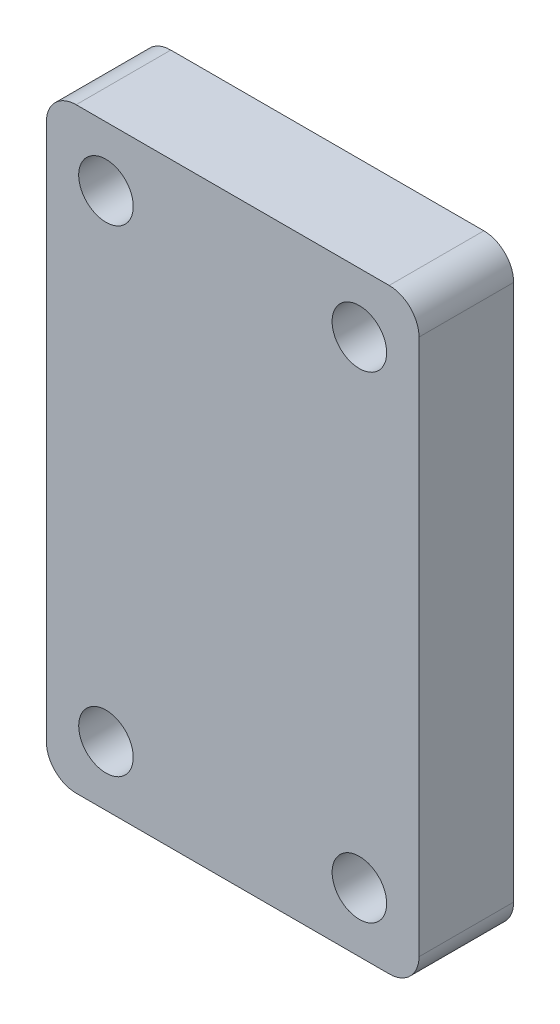
ISO-10303-21;
HEADER;
FILE_DESCRIPTION(('STEP AP214'),'2;1');
FILE_NAME('part.step','',(''),(''),'','','');
FILE_SCHEMA(('AUTOMOTIVE_DESIGN { 1 0 10303 214 1 1 1 1 }'));
ENDSEC;
DATA;
#1=APPLICATION_CONTEXT('core data for automotive mechanical design processes');
#2=APPLICATION_PROTOCOL_DEFINITION('international standard','automotive_design',2000,#1);
#3=PRODUCT_CONTEXT('',#1,'mechanical');
#4=PRODUCT('Part','Part','',(#3));
#5=PRODUCT_RELATED_PRODUCT_CATEGORY('part','',(#4));
#6=PRODUCT_DEFINITION_FORMATION('','',#4);
#7=PRODUCT_DEFINITION_CONTEXT('part definition',#1,'design');
#8=PRODUCT_DEFINITION('design','',#6,#7);
#9=PRODUCT_DEFINITION_SHAPE('','',#8);
#10=(LENGTH_UNIT() NAMED_UNIT(*) SI_UNIT(.MILLI.,.METRE.));
#11=(NAMED_UNIT(*) PLANE_ANGLE_UNIT() SI_UNIT($,.RADIAN.));
#12=(NAMED_UNIT(*) SI_UNIT($,.STERADIAN.) SOLID_ANGLE_UNIT());
#13=UNCERTAINTY_MEASURE_WITH_UNIT(LENGTH_MEASURE(1.E-05),#10,'distance_accuracy_value','');
#14=(GEOMETRIC_REPRESENTATION_CONTEXT(3) GLOBAL_UNCERTAINTY_ASSIGNED_CONTEXT((#13)) GLOBAL_UNIT_ASSIGNED_CONTEXT((#10,
#11,#12)) REPRESENTATION_CONTEXT('',''));
#15=CARTESIAN_POINT('',(0.,0.,0.));
#16=DIRECTION('',(0.,0.,1.));
#17=DIRECTION('',(1.,0.,0.));
#18=AXIS2_PLACEMENT_3D('',#15,#16,#17);
#19=CARTESIAN_POINT('',(-12.5,20.,3.175));
#20=DIRECTION('',(1.,0.,0.));
#21=DIRECTION('',(0.,0.,-1.));
#22=AXIS2_PLACEMENT_3D('',#19,#20,#21);
#23=PLANE('',#22);
#24=DIRECTION('',(0.,-1.,0.));
#25=VECTOR('',#24,1.);
#26=CARTESIAN_POINT('',(-12.5,20.,-3.175));
#27=LINE('',#26,#25);
#28=CARTESIAN_POINT('',(-12.5,18.,-3.175));
#29=VERTEX_POINT('',#28);
#30=CARTESIAN_POINT('',(-12.5,-18.,-3.175));
#31=VERTEX_POINT('',#30);
#32=EDGE_CURVE('E135',#29,#31,#27,.T.);
#33=ORIENTED_EDGE('',*,*,#32,.T.);
#34=DIRECTION('',(0.,0.,-1.));
#35=VECTOR('',#34,1.);
#36=CARTESIAN_POINT('',(-12.5,-18.,3.175));
#37=LINE('',#36,#35);
#38=CARTESIAN_POINT('',(-12.5,-18.,3.175));
#39=VERTEX_POINT('',#38);
#40=EDGE_CURVE('E110',#31,#39,#37,.F.);
#41=ORIENTED_EDGE('',*,*,#40,.T.);
#42=DIRECTION('',(0.,-1.,0.));
#43=VECTOR('',#42,1.);
#44=CARTESIAN_POINT('',(-12.5,20.,3.175));
#45=LINE('',#44,#43);
#46=CARTESIAN_POINT('',(-12.5,18.,3.175));
#47=VERTEX_POINT('',#46);
#48=EDGE_CURVE('E148',#47,#39,#45,.T.);
#49=ORIENTED_EDGE('',*,*,#48,.F.);
#50=DIRECTION('',(0.,0.,-1.));
#51=VECTOR('',#50,1.);
#52=CARTESIAN_POINT('',(-12.5,18.,3.175));
#53=LINE('',#52,#51);
#54=EDGE_CURVE('E116',#47,#29,#53,.T.);
#55=ORIENTED_EDGE('',*,*,#54,.T.);
#56=EDGE_LOOP('',(#33,#41,#49,#55));
#57=FACE_BOUND('',#56,.T.);
#58=ADVANCED_FACE('F39',(#57),#23,.F.);
#59=CARTESIAN_POINT('',(-12.5,-20.,3.175));
#60=DIRECTION('',(0.,1.,0.));
#61=DIRECTION('',(0.,0.,1.));
#62=AXIS2_PLACEMENT_3D('',#59,#60,#61);
#63=PLANE('',#62);
#64=DIRECTION('',(1.,0.,0.));
#65=VECTOR('',#64,1.);
#66=CARTESIAN_POINT('',(-12.5,-20.,3.175));
#67=LINE('',#66,#65);
#68=CARTESIAN_POINT('',(-10.5,-20.,3.175));
#69=VERTEX_POINT('',#68);
#70=CARTESIAN_POINT('',(10.5,-20.,3.175));
#71=VERTEX_POINT('',#70);
#72=EDGE_CURVE('E126',#69,#71,#67,.T.);
#73=ORIENTED_EDGE('',*,*,#72,.F.);
#74=DIRECTION('',(0.,0.,-1.));
#75=VECTOR('',#74,1.);
#76=CARTESIAN_POINT('',(-10.5,-20.,3.175));
#77=LINE('',#76,#75);
#78=CARTESIAN_POINT('',(-10.5,-20.,-3.175));
#79=VERTEX_POINT('',#78);
#80=EDGE_CURVE('E109',#69,#79,#77,.T.);
#81=ORIENTED_EDGE('',*,*,#80,.T.);
#82=DIRECTION('',(1.,0.,0.));
#83=VECTOR('',#82,1.);
#84=CARTESIAN_POINT('',(-12.5,-20.,-3.175));
#85=LINE('',#84,#83);
#86=CARTESIAN_POINT('',(10.5,-20.,-3.175));
#87=VERTEX_POINT('',#86);
#88=EDGE_CURVE('E123',#79,#87,#85,.T.);
#89=ORIENTED_EDGE('',*,*,#88,.T.);
#90=DIRECTION('',(0.,0.,-1.));
#91=VECTOR('',#90,1.);
#92=CARTESIAN_POINT('',(10.5,-20.,3.175));
#93=LINE('',#92,#91);
#94=EDGE_CURVE('E129',#87,#71,#93,.F.);
#95=ORIENTED_EDGE('',*,*,#94,.T.);
#96=EDGE_LOOP('',(#73,#81,#89,#95));
#97=FACE_BOUND('',#96,.T.);
#98=ADVANCED_FACE('F122',(#97),#63,.F.);
#99=CARTESIAN_POINT('',(12.5,20.,3.175));
#100=DIRECTION('',(-1.,0.,0.));
#101=DIRECTION('',(0.,0.,1.));
#102=AXIS2_PLACEMENT_3D('',#99,#100,#101);
#103=PLANE('',#102);
#104=DIRECTION('',(0.,1.,0.));
#105=VECTOR('',#104,1.);
#106=CARTESIAN_POINT('',(12.5,20.,3.175));
#107=LINE('',#106,#105);
#108=CARTESIAN_POINT('',(12.5,-18.,3.175));
#109=VERTEX_POINT('',#108);
#110=CARTESIAN_POINT('',(12.5,18.,3.175));
#111=VERTEX_POINT('',#110);
#112=EDGE_CURVE('E197',#109,#111,#107,.T.);
#113=ORIENTED_EDGE('',*,*,#112,.F.);
#114=DIRECTION('',(0.,0.,-1.));
#115=VECTOR('',#114,1.);
#116=CARTESIAN_POINT('',(12.5,-18.,3.175));
#117=LINE('',#116,#115);
#118=CARTESIAN_POINT('',(12.5,-18.,-3.175));
#119=VERTEX_POINT('',#118);
#120=EDGE_CURVE('E178',#109,#119,#117,.T.);
#121=ORIENTED_EDGE('',*,*,#120,.T.);
#122=DIRECTION('',(0.,1.,0.));
#123=VECTOR('',#122,1.);
#124=CARTESIAN_POINT('',(12.5,20.,-3.175));
#125=LINE('',#124,#123);
#126=CARTESIAN_POINT('',(12.5,18.,-3.175));
#127=VERTEX_POINT('',#126);
#128=EDGE_CURVE('E134',#119,#127,#125,.T.);
#129=ORIENTED_EDGE('',*,*,#128,.T.);
#130=DIRECTION('',(0.,0.,-1.));
#131=VECTOR('',#130,1.);
#132=CARTESIAN_POINT('',(12.5,18.,3.175));
#133=LINE('',#132,#131);
#134=EDGE_CURVE('E175',#127,#111,#133,.F.);
#135=ORIENTED_EDGE('',*,*,#134,.T.);
#136=EDGE_LOOP('',(#113,#121,#129,#135));
#137=FACE_BOUND('',#136,.T.);
#138=ADVANCED_FACE('F215',(#137),#103,.F.);
#139=CARTESIAN_POINT('',(-12.5,20.,3.175));
#140=DIRECTION('',(0.,-1.,0.));
#141=DIRECTION('',(0.,0.,-1.));
#142=AXIS2_PLACEMENT_3D('',#139,#140,#141);
#143=PLANE('',#142);
#144=DIRECTION('',(-1.,0.,0.));
#145=VECTOR('',#144,1.);
#146=CARTESIAN_POINT('',(-12.5,20.,-3.175));
#147=LINE('',#146,#145);
#148=CARTESIAN_POINT('',(10.5,20.,-3.175));
#149=VERTEX_POINT('',#148);
#150=CARTESIAN_POINT('',(-10.5,20.,-3.175));
#151=VERTEX_POINT('',#150);
#152=EDGE_CURVE('E140',#149,#151,#147,.T.);
#153=ORIENTED_EDGE('',*,*,#152,.T.);
#154=DIRECTION('',(0.,0.,-1.));
#155=VECTOR('',#154,1.);
#156=CARTESIAN_POINT('',(-10.5,20.,3.175));
#157=LINE('',#156,#155);
#158=CARTESIAN_POINT('',(-10.5,20.,3.175));
#159=VERTEX_POINT('',#158);
#160=EDGE_CURVE('E11',#151,#159,#157,.F.);
#161=ORIENTED_EDGE('',*,*,#160,.T.);
#162=DIRECTION('',(-1.,0.,0.));
#163=VECTOR('',#162,1.);
#164=CARTESIAN_POINT('',(-12.5,20.,3.175));
#165=LINE('',#164,#163);
#166=CARTESIAN_POINT('',(10.5,20.,3.175));
#167=VERTEX_POINT('',#166);
#168=EDGE_CURVE('E150',#167,#159,#165,.T.);
#169=ORIENTED_EDGE('',*,*,#168,.F.);
#170=DIRECTION('',(0.,0.,-1.));
#171=VECTOR('',#170,1.);
#172=CARTESIAN_POINT('',(10.5,20.,3.175));
#173=LINE('',#172,#171);
#174=EDGE_CURVE('E48',#167,#149,#173,.T.);
#175=ORIENTED_EDGE('',*,*,#174,.T.);
#176=EDGE_LOOP('',(#153,#161,#169,#175));
#177=FACE_BOUND('',#176,.T.);
#178=ADVANCED_FACE('F185',(#177),#143,.F.);
#179=CARTESIAN_POINT('',(0.,0.,3.175));
#180=DIRECTION('',(0.,0.,1.));
#181=DIRECTION('',(1.,0.,0.));
#182=AXIS2_PLACEMENT_3D('',#179,#180,#181);
#183=PLANE('',#182);
#184=CARTESIAN_POINT('',(-8.5,-16.,3.175));
#185=DIRECTION('',(0.,0.,1.));
#186=DIRECTION('',(-1.,0.,0.));
#187=AXIS2_PLACEMENT_3D('',#184,#185,#186);
#188=CIRCLE('',#187,1.83);
#189=CARTESIAN_POINT('',(-10.33,-16.,3.175));
#190=VERTEX_POINT('',#189);
#191=EDGE_CURVE('E345',#190,#190,#188,.T.);
#192=ORIENTED_EDGE('',*,*,#191,.F.);
#193=EDGE_LOOP('',(#192));
#194=FACE_BOUND('',#193,.T.);
#195=CARTESIAN_POINT('',(8.5,-16.,3.175));
#196=DIRECTION('',(0.,0.,1.));
#197=DIRECTION('',(1.,0.,0.));
#198=AXIS2_PLACEMENT_3D('',#195,#196,#197);
#199=CIRCLE('',#198,1.83);
#200=CARTESIAN_POINT('',(10.33,-16.,3.175));
#201=VERTEX_POINT('',#200);
#202=EDGE_CURVE('E344',#201,#201,#199,.T.);
#203=ORIENTED_EDGE('',*,*,#202,.F.);
#204=EDGE_LOOP('',(#203));
#205=FACE_BOUND('',#204,.T.);
#206=CARTESIAN_POINT('',(8.5,16.,3.175));
#207=DIRECTION('',(0.,0.,1.));
#208=DIRECTION('',(-1.,0.,0.));
#209=AXIS2_PLACEMENT_3D('',#206,#207,#208);
#210=CIRCLE('',#209,1.83);
#211=CARTESIAN_POINT('',(6.67,16.,3.175));
#212=VERTEX_POINT('',#211);
#213=EDGE_CURVE('E337',#212,#212,#210,.T.);
#214=ORIENTED_EDGE('',*,*,#213,.F.);
#215=EDGE_LOOP('',(#214));
#216=FACE_BOUND('',#215,.T.);
#217=CARTESIAN_POINT('',(-8.5,16.,3.175));
#218=DIRECTION('',(0.,0.,1.));
#219=DIRECTION('',(1.,0.,0.));
#220=AXIS2_PLACEMENT_3D('',#217,#218,#219);
#221=CIRCLE('',#220,1.83);
#222=CARTESIAN_POINT('',(-6.67,16.,3.175));
#223=VERTEX_POINT('',#222);
#224=EDGE_CURVE('E328',#223,#223,#221,.T.);
#225=ORIENTED_EDGE('',*,*,#224,.F.);
#226=EDGE_LOOP('',(#225));
#227=FACE_BOUND('',#226,.T.);
#228=ORIENTED_EDGE('',*,*,#48,.T.);
#229=CARTESIAN_POINT('',(-10.5,-18.,3.175));
#230=DIRECTION('',(0.,0.,1.));
#231=DIRECTION('',(1.,0.,0.));
#232=AXIS2_PLACEMENT_3D('',#229,#230,#231);
#233=CIRCLE('',#232,2.);
#234=EDGE_CURVE('E172',#39,#69,#233,.T.);
#235=ORIENTED_EDGE('',*,*,#234,.T.);
#236=ORIENTED_EDGE('',*,*,#72,.T.);
#237=CARTESIAN_POINT('',(10.5,-18.,3.175));
#238=DIRECTION('',(0.,0.,1.));
#239=DIRECTION('',(1.,0.,0.));
#240=AXIS2_PLACEMENT_3D('',#237,#238,#239);
#241=CIRCLE('',#240,2.);
#242=EDGE_CURVE('E169',#71,#109,#241,.T.);
#243=ORIENTED_EDGE('',*,*,#242,.T.);
#244=ORIENTED_EDGE('',*,*,#112,.T.);
#245=CARTESIAN_POINT('',(10.5,18.,3.175));
#246=DIRECTION('',(0.,0.,1.));
#247=DIRECTION('',(1.,0.,0.));
#248=AXIS2_PLACEMENT_3D('',#245,#246,#247);
#249=CIRCLE('',#248,2.);
#250=EDGE_CURVE('E60',#111,#167,#249,.T.);
#251=ORIENTED_EDGE('',*,*,#250,.T.);
#252=ORIENTED_EDGE('',*,*,#168,.T.);
#253=CARTESIAN_POINT('',(-10.5,18.,3.175));
#254=DIRECTION('',(0.,0.,1.));
#255=DIRECTION('',(1.,0.,0.));
#256=AXIS2_PLACEMENT_3D('',#253,#254,#255);
#257=CIRCLE('',#256,2.);
#258=EDGE_CURVE('E166',#159,#47,#257,.T.);
#259=ORIENTED_EDGE('',*,*,#258,.T.);
#260=EDGE_LOOP('',(#228,#235,#236,#243,#244,#251,#252,#259));
#261=FACE_BOUND('',#260,.T.);
#262=ADVANCED_FACE('F204',(#194,#205,#216,#227,#261),#183,.T.);
#263=CARTESIAN_POINT('',(0.,0.,-3.175));
#264=DIRECTION('',(0.,0.,1.));
#265=DIRECTION('',(1.,0.,0.));
#266=AXIS2_PLACEMENT_3D('',#263,#264,#265);
#267=PLANE('',#266);
#268=CARTESIAN_POINT('',(-8.5,-16.,-3.175));
#269=DIRECTION('',(0.,0.,1.));
#270=DIRECTION('',(1.,0.,0.));
#271=AXIS2_PLACEMENT_3D('',#268,#269,#270);
#272=CIRCLE('',#271,1.83);
#273=CARTESIAN_POINT('',(-6.67,-16.,-3.175));
#274=VERTEX_POINT('',#273);
#275=EDGE_CURVE('E340',#274,#274,#272,.F.);
#276=ORIENTED_EDGE('',*,*,#275,.F.);
#277=EDGE_LOOP('',(#276));
#278=FACE_BOUND('',#277,.T.);
#279=CARTESIAN_POINT('',(8.5,-16.,-3.175));
#280=DIRECTION('',(0.,0.,1.));
#281=DIRECTION('',(1.,0.,0.));
#282=AXIS2_PLACEMENT_3D('',#279,#280,#281);
#283=CIRCLE('',#282,1.83);
#284=CARTESIAN_POINT('',(10.33,-16.,-3.175));
#285=VERTEX_POINT('',#284);
#286=EDGE_CURVE('E349',#285,#285,#283,.F.);
#287=ORIENTED_EDGE('',*,*,#286,.F.);
#288=EDGE_LOOP('',(#287));
#289=FACE_BOUND('',#288,.T.);
#290=CARTESIAN_POINT('',(8.5,16.,-3.175));
#291=DIRECTION('',(0.,0.,1.));
#292=DIRECTION('',(1.,0.,0.));
#293=AXIS2_PLACEMENT_3D('',#290,#291,#292);
#294=CIRCLE('',#293,1.83);
#295=CARTESIAN_POINT('',(10.33,16.,-3.175));
#296=VERTEX_POINT('',#295);
#297=EDGE_CURVE('E334',#296,#296,#294,.F.);
#298=ORIENTED_EDGE('',*,*,#297,.F.);
#299=EDGE_LOOP('',(#298));
#300=FACE_BOUND('',#299,.T.);
#301=CARTESIAN_POINT('',(-8.5,16.,-3.175));
#302=DIRECTION('',(0.,0.,1.));
#303=DIRECTION('',(1.,0.,0.));
#304=AXIS2_PLACEMENT_3D('',#301,#302,#303);
#305=CIRCLE('',#304,1.83);
#306=CARTESIAN_POINT('',(-6.67,16.,-3.175));
#307=VERTEX_POINT('',#306);
#308=EDGE_CURVE('E142',#307,#307,#305,.F.);
#309=ORIENTED_EDGE('',*,*,#308,.F.);
#310=EDGE_LOOP('',(#309));
#311=FACE_BOUND('',#310,.T.);
#312=ORIENTED_EDGE('',*,*,#88,.F.);
#313=CARTESIAN_POINT('',(-10.5,-18.,-3.175));
#314=DIRECTION('',(0.,0.,1.));
#315=DIRECTION('',(1.,0.,0.));
#316=AXIS2_PLACEMENT_3D('',#313,#314,#315);
#317=CIRCLE('',#316,2.);
#318=EDGE_CURVE('E105',#79,#31,#317,.F.);
#319=ORIENTED_EDGE('',*,*,#318,.T.);
#320=ORIENTED_EDGE('',*,*,#32,.F.);
#321=CARTESIAN_POINT('',(-10.5,18.,-3.175));
#322=DIRECTION('',(0.,0.,1.));
#323=DIRECTION('',(1.,0.,0.));
#324=AXIS2_PLACEMENT_3D('',#321,#322,#323);
#325=CIRCLE('',#324,2.);
#326=EDGE_CURVE('E154',#29,#151,#325,.F.);
#327=ORIENTED_EDGE('',*,*,#326,.T.);
#328=ORIENTED_EDGE('',*,*,#152,.F.);
#329=CARTESIAN_POINT('',(10.5,18.,-3.175));
#330=DIRECTION('',(0.,0.,1.));
#331=DIRECTION('',(1.,0.,0.));
#332=AXIS2_PLACEMENT_3D('',#329,#330,#331);
#333=CIRCLE('',#332,2.);
#334=EDGE_CURVE('E128',#149,#127,#333,.F.);
#335=ORIENTED_EDGE('',*,*,#334,.T.);
#336=ORIENTED_EDGE('',*,*,#128,.F.);
#337=CARTESIAN_POINT('',(10.5,-18.,-3.175));
#338=DIRECTION('',(0.,0.,1.));
#339=DIRECTION('',(1.,0.,0.));
#340=AXIS2_PLACEMENT_3D('',#337,#338,#339);
#341=CIRCLE('',#340,2.);
#342=EDGE_CURVE('E117',#119,#87,#341,.F.);
#343=ORIENTED_EDGE('',*,*,#342,.T.);
#344=EDGE_LOOP('',(#312,#319,#320,#327,#328,#335,#336,#343));
#345=FACE_BOUND('',#344,.T.);
#346=ADVANCED_FACE('F131',(#278,#289,#300,#311,#345),#267,.F.);
#347=CARTESIAN_POINT('',(-8.5,16.,-3.176));
#348=DIRECTION('',(0.,0.,1.));
#349=DIRECTION('',(1.,0.,0.));
#350=AXIS2_PLACEMENT_3D('',#347,#348,#349);
#351=CYLINDRICAL_SURFACE('',#350,1.83);
#352=ORIENTED_EDGE('',*,*,#224,.T.);
#353=EDGE_LOOP('',(#352));
#354=FACE_BOUND('',#353,.T.);
#355=ORIENTED_EDGE('',*,*,#308,.T.);
#356=EDGE_LOOP('',(#355));
#357=FACE_BOUND('',#356,.T.);
#358=ADVANCED_FACE('F212',(#354,#357),#351,.F.);
#359=CARTESIAN_POINT('',(8.5,16.,-3.176));
#360=DIRECTION('',(0.,0.,1.));
#361=DIRECTION('',(1.,0.,0.));
#362=AXIS2_PLACEMENT_3D('',#359,#360,#361);
#363=CYLINDRICAL_SURFACE('',#362,1.83);
#364=ORIENTED_EDGE('',*,*,#213,.T.);
#365=EDGE_LOOP('',(#364));
#366=FACE_BOUND('',#365,.T.);
#367=ORIENTED_EDGE('',*,*,#297,.T.);
#368=EDGE_LOOP('',(#367));
#369=FACE_BOUND('',#368,.T.);
#370=ADVANCED_FACE('F302',(#366,#369),#363,.F.);
#371=CARTESIAN_POINT('',(8.5,-16.,-3.176));
#372=DIRECTION('',(0.,0.,1.));
#373=DIRECTION('',(1.,0.,0.));
#374=AXIS2_PLACEMENT_3D('',#371,#372,#373);
#375=CYLINDRICAL_SURFACE('',#374,1.83);
#376=ORIENTED_EDGE('',*,*,#202,.T.);
#377=EDGE_LOOP('',(#376));
#378=FACE_BOUND('',#377,.T.);
#379=ORIENTED_EDGE('',*,*,#286,.T.);
#380=EDGE_LOOP('',(#379));
#381=FACE_BOUND('',#380,.T.);
#382=ADVANCED_FACE('F295',(#378,#381),#375,.F.);
#383=CARTESIAN_POINT('',(-8.5,-16.,-3.176));
#384=DIRECTION('',(0.,0.,1.));
#385=DIRECTION('',(1.,0.,0.));
#386=AXIS2_PLACEMENT_3D('',#383,#384,#385);
#387=CYLINDRICAL_SURFACE('',#386,1.83);
#388=ORIENTED_EDGE('',*,*,#191,.T.);
#389=EDGE_LOOP('',(#388));
#390=FACE_BOUND('',#389,.T.);
#391=ORIENTED_EDGE('',*,*,#275,.T.);
#392=EDGE_LOOP('',(#391));
#393=FACE_BOUND('',#392,.T.);
#394=ADVANCED_FACE('F231',(#390,#393),#387,.F.);
#395=CARTESIAN_POINT('',(-10.5,-18.,3.175));
#396=DIRECTION('',(0.,0.,-1.));
#397=DIRECTION('',(-1.,0.,0.));
#398=AXIS2_PLACEMENT_3D('',#395,#396,#397);
#399=CYLINDRICAL_SURFACE('',#398,2.);
#400=ORIENTED_EDGE('',*,*,#234,.F.);
#401=ORIENTED_EDGE('',*,*,#40,.F.);
#402=ORIENTED_EDGE('',*,*,#318,.F.);
#403=ORIENTED_EDGE('',*,*,#80,.F.);
#404=EDGE_LOOP('',(#400,#401,#402,#403));
#405=FACE_BOUND('',#404,.T.);
#406=ADVANCED_FACE('F108',(#405),#399,.T.);
#407=CARTESIAN_POINT('',(10.5,-18.,3.175));
#408=DIRECTION('',(0.,0.,-1.));
#409=DIRECTION('',(-1.,0.,0.));
#410=AXIS2_PLACEMENT_3D('',#407,#408,#409);
#411=CYLINDRICAL_SURFACE('',#410,2.);
#412=ORIENTED_EDGE('',*,*,#242,.F.);
#413=ORIENTED_EDGE('',*,*,#94,.F.);
#414=ORIENTED_EDGE('',*,*,#342,.F.);
#415=ORIENTED_EDGE('',*,*,#120,.F.);
#416=EDGE_LOOP('',(#412,#413,#414,#415));
#417=FACE_BOUND('',#416,.T.);
#418=ADVANCED_FACE('F230',(#417),#411,.T.);
#419=CARTESIAN_POINT('',(-10.5,18.,3.175));
#420=DIRECTION('',(0.,0.,-1.));
#421=DIRECTION('',(-1.,0.,0.));
#422=AXIS2_PLACEMENT_3D('',#419,#420,#421);
#423=CYLINDRICAL_SURFACE('',#422,2.);
#424=ORIENTED_EDGE('',*,*,#258,.F.);
#425=ORIENTED_EDGE('',*,*,#160,.F.);
#426=ORIENTED_EDGE('',*,*,#326,.F.);
#427=ORIENTED_EDGE('',*,*,#54,.F.);
#428=EDGE_LOOP('',(#424,#425,#426,#427));
#429=FACE_BOUND('',#428,.T.);
#430=ADVANCED_FACE('F190',(#429),#423,.T.);
#431=CARTESIAN_POINT('',(10.5,18.,3.175));
#432=DIRECTION('',(0.,0.,-1.));
#433=DIRECTION('',(-1.,0.,0.));
#434=AXIS2_PLACEMENT_3D('',#431,#432,#433);
#435=CYLINDRICAL_SURFACE('',#434,2.);
#436=ORIENTED_EDGE('',*,*,#250,.F.);
#437=ORIENTED_EDGE('',*,*,#134,.F.);
#438=ORIENTED_EDGE('',*,*,#334,.F.);
#439=ORIENTED_EDGE('',*,*,#174,.F.);
#440=EDGE_LOOP('',(#436,#437,#438,#439));
#441=FACE_BOUND('',#440,.T.);
#442=ADVANCED_FACE('F41',(#441),#435,.T.);
#443=CLOSED_SHELL('',(#58,#98,#138,#178,#262,#346,#358,#370,#382,#394,#406,#418,#430,#442));
#444=MANIFOLD_SOLID_BREP('B2',#443);
#445=ADVANCED_BREP_SHAPE_REPRESENTATION('',(#18,#444),#14);
#446=SHAPE_DEFINITION_REPRESENTATION(#9,#445);
ENDSEC;
END-ISO-10303-21;
